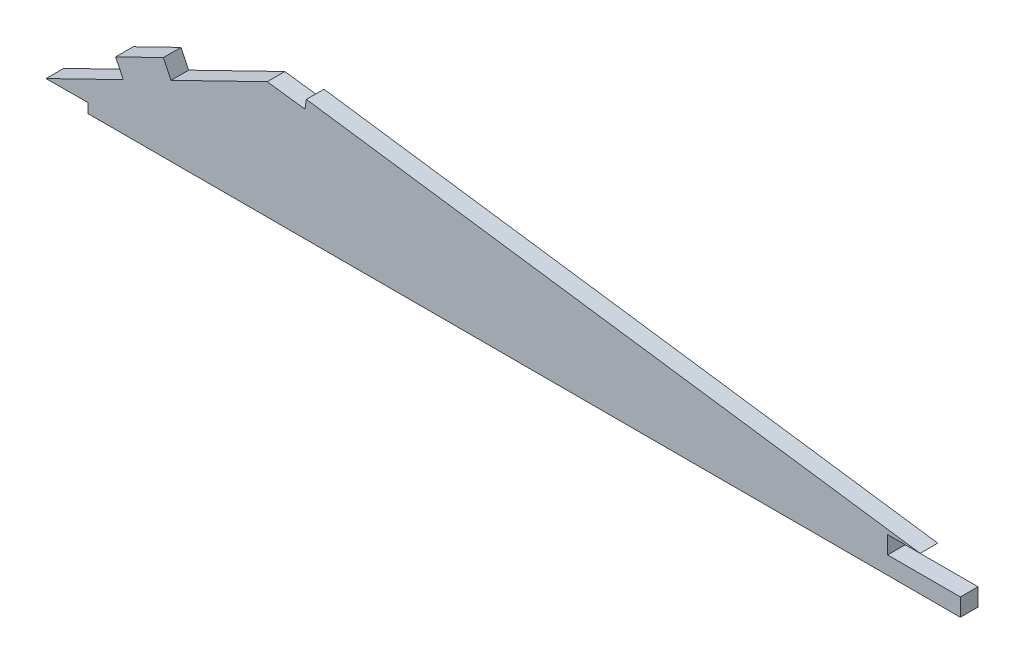
ISO-10303-21;
HEADER;
FILE_DESCRIPTION(('STEP AP214'),'2;1');
FILE_NAME('part.step','',(''),(''),'','','');
FILE_SCHEMA(('AUTOMOTIVE_DESIGN { 1 0 10303 214 1 1 1 1 }'));
ENDSEC;
DATA;
#1=APPLICATION_CONTEXT('core data for automotive mechanical design processes');
#2=APPLICATION_PROTOCOL_DEFINITION('international standard','automotive_design',2000,#1);
#3=PRODUCT_CONTEXT('',#1,'mechanical');
#4=PRODUCT('Part','Part','',(#3));
#5=PRODUCT_RELATED_PRODUCT_CATEGORY('part','',(#4));
#6=PRODUCT_DEFINITION_FORMATION('','',#4);
#7=PRODUCT_DEFINITION_CONTEXT('part definition',#1,'design');
#8=PRODUCT_DEFINITION('design','',#6,#7);
#9=PRODUCT_DEFINITION_SHAPE('','',#8);
#10=(LENGTH_UNIT() NAMED_UNIT(*) SI_UNIT(.MILLI.,.METRE.));
#11=(NAMED_UNIT(*) PLANE_ANGLE_UNIT() SI_UNIT($,.RADIAN.));
#12=(NAMED_UNIT(*) SI_UNIT($,.STERADIAN.) SOLID_ANGLE_UNIT());
#13=UNCERTAINTY_MEASURE_WITH_UNIT(LENGTH_MEASURE(1.E-05),#10,'distance_accuracy_value','');
#14=(GEOMETRIC_REPRESENTATION_CONTEXT(3) GLOBAL_UNCERTAINTY_ASSIGNED_CONTEXT((#13)) GLOBAL_UNIT_ASSIGNED_CONTEXT((#10,
#11,#12)) REPRESENTATION_CONTEXT('',''));
#15=CARTESIAN_POINT('',(0.,0.,0.));
#16=DIRECTION('',(0.,0.,1.));
#17=DIRECTION('',(1.,0.,0.));
#18=AXIS2_PLACEMENT_3D('',#15,#16,#17);
#19=CARTESIAN_POINT('',(15.844545114635,14.6199005087343,2.));
#20=DIRECTION('',(-0.898794046299282,-0.438371146788841,0.));
#21=DIRECTION('',(0.438371146788841,-0.898794046299282,0.));
#22=AXIS2_PLACEMENT_3D('',#19,#20,#21);
#23=PLANE('',#22);
#24=DIRECTION('',(-0.438371146788841,0.898794046299282,0.));
#25=VECTOR('',#24,1.);
#26=CARTESIAN_POINT('',(15.844545114635,14.6199005087343,0.));
#27=LINE('',#26,#25);
#28=CARTESIAN_POINT('',(16.721287408213,12.8223124161351,0.));
#29=VERTEX_POINT('',#28);
#30=CARTESIAN_POINT('',(15.844545114635,14.6199005087343,0.));
#31=VERTEX_POINT('',#30);
#32=EDGE_CURVE('E182',#29,#31,#27,.T.);
#33=ORIENTED_EDGE('',*,*,#32,.T.);
#34=DIRECTION('',(0.,0.,-1.));
#35=VECTOR('',#34,1.);
#36=CARTESIAN_POINT('',(15.844545114635,14.6199005087343,2.));
#37=LINE('',#36,#35);
#38=CARTESIAN_POINT('',(15.844545114635,14.6199005087343,2.));
#39=VERTEX_POINT('',#38);
#40=EDGE_CURVE('E11',#39,#31,#37,.T.);
#41=ORIENTED_EDGE('',*,*,#40,.F.);
#42=DIRECTION('',(-0.438371146788841,0.898794046299282,0.));
#43=VECTOR('',#42,1.);
#44=CARTESIAN_POINT('',(15.844545114635,14.6199005087343,2.));
#45=LINE('',#44,#43);
#46=CARTESIAN_POINT('',(16.721287408213,12.8223124161351,2.));
#47=VERTEX_POINT('',#46);
#48=EDGE_CURVE('E225',#47,#39,#45,.T.);
#49=ORIENTED_EDGE('',*,*,#48,.F.);
#50=DIRECTION('',(0.,0.,-1.));
#51=VECTOR('',#50,1.);
#52=CARTESIAN_POINT('',(16.721287408213,12.8223124161351,2.));
#53=LINE('',#52,#51);
#54=EDGE_CURVE('E178',#47,#29,#53,.T.);
#55=ORIENTED_EDGE('',*,*,#54,.T.);
#56=EDGE_LOOP('',(#33,#41,#49,#55));
#57=FACE_BOUND('',#56,.T.);
#58=ADVANCED_FACE('F39',(#57),#23,.F.);
#59=CARTESIAN_POINT('',(10.4258955683068,11.9770485389714,2.));
#60=DIRECTION('',(0.438371146789212,-0.898794046299101,0.));
#61=DIRECTION('',(0.898794046299101,0.438371146789212,0.));
#62=AXIS2_PLACEMENT_3D('',#59,#60,#61);
#63=PLANE('',#62);
#64=DIRECTION('',(-0.898794046299101,-0.438371146789212,0.));
#65=VECTOR('',#64,1.);
#66=CARTESIAN_POINT('',(10.4258955683068,11.9770485389714,0.));
#67=LINE('',#66,#65);
#68=CARTESIAN_POINT('',(10.4258955683068,11.9770485389714,0.));
#69=VERTEX_POINT('',#68);
#70=EDGE_CURVE('E186',#31,#69,#67,.T.);
#71=ORIENTED_EDGE('',*,*,#70,.T.);
#72=DIRECTION('',(0.,0.,-1.));
#73=VECTOR('',#72,1.);
#74=CARTESIAN_POINT('',(10.4258955683068,11.9770485389714,2.));
#75=LINE('',#74,#73);
#76=CARTESIAN_POINT('',(10.4258955683068,11.9770485389714,2.));
#77=VERTEX_POINT('',#76);
#78=EDGE_CURVE('E48',#77,#69,#75,.T.);
#79=ORIENTED_EDGE('',*,*,#78,.F.);
#80=DIRECTION('',(-0.898794046299101,-0.438371146789212,0.));
#81=VECTOR('',#80,1.);
#82=CARTESIAN_POINT('',(10.4258955683068,11.9770485389714,2.));
#83=LINE('',#82,#81);
#84=EDGE_CURVE('E120',#39,#77,#83,.T.);
#85=ORIENTED_EDGE('',*,*,#84,.F.);
#86=ORIENTED_EDGE('',*,*,#40,.T.);
#87=EDGE_LOOP('',(#71,#79,#85,#86));
#88=FACE_BOUND('',#87,.T.);
#89=ADVANCED_FACE('F340',(#88),#63,.F.);
#90=CARTESIAN_POINT('',(11.3026378618857,10.1794604463754,2.));
#91=DIRECTION('',(0.898794046298798,0.438371146789834,0.));
#92=DIRECTION('',(-0.438371146789834,0.898794046298798,0.));
#93=AXIS2_PLACEMENT_3D('',#90,#91,#92);
#94=PLANE('',#93);
#95=DIRECTION('',(0.438371146789834,-0.898794046298798,0.));
#96=VECTOR('',#95,1.);
#97=CARTESIAN_POINT('',(11.3026378618857,10.1794604463754,0.));
#98=LINE('',#97,#96);
#99=CARTESIAN_POINT('',(11.3026378618857,10.1794604463754,0.));
#100=VERTEX_POINT('',#99);
#101=EDGE_CURVE('E189',#69,#100,#98,.T.);
#102=ORIENTED_EDGE('',*,*,#101,.T.);
#103=DIRECTION('',(0.,0.,-1.));
#104=VECTOR('',#103,1.);
#105=CARTESIAN_POINT('',(11.3026378618857,10.1794604463754,2.));
#106=LINE('',#105,#104);
#107=CARTESIAN_POINT('',(11.3026378618857,10.1794604463754,2.));
#108=VERTEX_POINT('',#107);
#109=EDGE_CURVE('E264',#108,#100,#106,.T.);
#110=ORIENTED_EDGE('',*,*,#109,.F.);
#111=DIRECTION('',(0.438371146789834,-0.898794046298798,0.));
#112=VECTOR('',#111,1.);
#113=CARTESIAN_POINT('',(11.3026378618857,10.1794604463754,2.));
#114=LINE('',#113,#112);
#115=EDGE_CURVE('E274',#77,#108,#114,.T.);
#116=ORIENTED_EDGE('',*,*,#115,.F.);
#117=ORIENTED_EDGE('',*,*,#78,.T.);
#118=EDGE_LOOP('',(#102,#110,#116,#117));
#119=FACE_BOUND('',#118,.T.);
#120=ADVANCED_FACE('F272',(#119),#94,.F.);
#121=CARTESIAN_POINT('',(2.52896989953078,5.90025665987847,2.));
#122=DIRECTION('',(0.438371146789097,-0.898794046299158,0.));
#123=DIRECTION('',(0.898794046299158,0.438371146789097,0.));
#124=AXIS2_PLACEMENT_3D('',#121,#122,#123);
#125=PLANE('',#124);
#126=DIRECTION('',(-0.898794046299158,-0.438371146789097,0.));
#127=VECTOR('',#126,1.);
#128=CARTESIAN_POINT('',(2.52896989953078,5.90025665987847,0.));
#129=LINE('',#128,#127);
#130=CARTESIAN_POINT('',(2.52896989953078,5.90025665987847,0.));
#131=VERTEX_POINT('',#130);
#132=EDGE_CURVE('E192',#100,#131,#129,.T.);
#133=ORIENTED_EDGE('',*,*,#132,.T.);
#134=DIRECTION('',(0.,0.,-1.));
#135=VECTOR('',#134,1.);
#136=CARTESIAN_POINT('',(2.52896989953078,5.90025665987847,2.));
#137=LINE('',#136,#135);
#138=CARTESIAN_POINT('',(2.52896989953078,5.90025665987847,2.));
#139=VERTEX_POINT('',#138);
#140=EDGE_CURVE('E260',#139,#131,#137,.T.);
#141=ORIENTED_EDGE('',*,*,#140,.F.);
#142=DIRECTION('',(-0.898794046299158,-0.438371146789097,0.));
#143=VECTOR('',#142,1.);
#144=CARTESIAN_POINT('',(2.52896989953078,5.90025665987847,2.));
#145=LINE('',#144,#143);
#146=EDGE_CURVE('E293',#108,#139,#145,.T.);
#147=ORIENTED_EDGE('',*,*,#146,.F.);
#148=ORIENTED_EDGE('',*,*,#109,.T.);
#149=EDGE_LOOP('',(#133,#141,#147,#148));
#150=FACE_BOUND('',#149,.T.);
#151=ADVANCED_FACE('F283',(#150),#125,.F.);
#152=CARTESIAN_POINT('',(7.31043569777975,5.91881293104703,2.));
#153=DIRECTION('',(-0.00388084579359874,0.999992469489609,0.));
#154=DIRECTION('',(-0.999992469489609,-0.00388084579359874,0.));
#155=AXIS2_PLACEMENT_3D('',#152,#153,#154);
#156=PLANE('',#155);
#157=DIRECTION('',(0.999992469489609,0.00388084579359873,0.));
#158=VECTOR('',#157,1.);
#159=CARTESIAN_POINT('',(7.31043569777975,5.91881293104703,0.));
#160=LINE('',#159,#158);
#161=CARTESIAN_POINT('',(7.31043569777975,5.91881293104703,0.));
#162=VERTEX_POINT('',#161);
#163=EDGE_CURVE('E195',#131,#162,#160,.T.);
#164=ORIENTED_EDGE('',*,*,#163,.T.);
#165=DIRECTION('',(0.,0.,-1.));
#166=VECTOR('',#165,1.);
#167=CARTESIAN_POINT('',(7.31043569777975,5.91881293104703,2.));
#168=LINE('',#167,#166);
#169=CARTESIAN_POINT('',(7.31043569777975,5.91881293104703,2.));
#170=VERTEX_POINT('',#169);
#171=EDGE_CURVE('E256',#170,#162,#168,.T.);
#172=ORIENTED_EDGE('',*,*,#171,.F.);
#173=DIRECTION('',(0.999992469489609,0.00388084579359873,0.));
#174=VECTOR('',#173,1.);
#175=CARTESIAN_POINT('',(7.31043569777975,5.91881293104703,2.));
#176=LINE('',#175,#174);
#177=EDGE_CURVE('E289',#139,#170,#176,.T.);
#178=ORIENTED_EDGE('',*,*,#177,.F.);
#179=ORIENTED_EDGE('',*,*,#140,.T.);
#180=EDGE_LOOP('',(#164,#172,#178,#179));
#181=FACE_BOUND('',#180,.T.);
#182=ADVANCED_FACE('F287',(#181),#156,.F.);
#183=CARTESIAN_POINT('',(7.3146393222456,4.83564883822297,2.));
#184=DIRECTION('',(0.99999246948962,0.00388084579082327,0.));
#185=DIRECTION('',(-0.00388084579082327,0.99999246948962,0.));
#186=AXIS2_PLACEMENT_3D('',#183,#184,#185);
#187=PLANE('',#186);
#188=DIRECTION('',(0.00388084579082327,-0.99999246948962,0.));
#189=VECTOR('',#188,1.);
#190=CARTESIAN_POINT('',(7.3146393222456,4.83564883822297,0.));
#191=LINE('',#190,#189);
#192=CARTESIAN_POINT('',(7.3146393222456,4.83564883822297,0.));
#193=VERTEX_POINT('',#192);
#194=EDGE_CURVE('E198',#162,#193,#191,.T.);
#195=ORIENTED_EDGE('',*,*,#194,.T.);
#196=DIRECTION('',(0.,0.,-1.));
#197=VECTOR('',#196,1.);
#198=CARTESIAN_POINT('',(7.3146393222456,4.83564883822297,2.));
#199=LINE('',#198,#197);
#200=CARTESIAN_POINT('',(7.3146393222456,4.83564883822297,2.));
#201=VERTEX_POINT('',#200);
#202=EDGE_CURVE('E252',#201,#193,#199,.T.);
#203=ORIENTED_EDGE('',*,*,#202,.F.);
#204=DIRECTION('',(0.00388084579082327,-0.99999246948962,0.));
#205=VECTOR('',#204,1.);
#206=CARTESIAN_POINT('',(7.3146393222456,4.83564883822297,2.));
#207=LINE('',#206,#205);
#208=EDGE_CURVE('E292',#170,#201,#207,.T.);
#209=ORIENTED_EDGE('',*,*,#208,.F.);
#210=ORIENTED_EDGE('',*,*,#171,.T.);
#211=EDGE_LOOP('',(#195,#203,#209,#210));
#212=FACE_BOUND('',#211,.T.);
#213=ADVANCED_FACE('F353',(#212),#187,.F.);
#214=CARTESIAN_POINT('',(7.3146393222456,4.83564883822297,2.));
#215=DIRECTION('',(0.,1.,0.));
#216=DIRECTION('',(0.,0.,1.));
#217=AXIS2_PLACEMENT_3D('',#214,#215,#216);
#218=PLANE('',#217);
#219=DIRECTION('',(1.,0.,0.));
#220=VECTOR('',#219,1.);
#221=CARTESIAN_POINT('',(7.3146393222456,4.83564883822297,0.));
#222=LINE('',#221,#220);
#223=CARTESIAN_POINT('',(106.29161027576,4.83564883822297,0.));
#224=VERTEX_POINT('',#223);
#225=EDGE_CURVE('E201',#193,#224,#222,.T.);
#226=ORIENTED_EDGE('',*,*,#225,.T.);
#227=DIRECTION('',(0.,0.,-1.));
#228=VECTOR('',#227,1.);
#229=CARTESIAN_POINT('',(106.29161027576,4.83564883822297,2.));
#230=LINE('',#229,#228);
#231=CARTESIAN_POINT('',(106.29161027576,4.83564883822297,2.));
#232=VERTEX_POINT('',#231);
#233=EDGE_CURVE('E248',#232,#224,#230,.T.);
#234=ORIENTED_EDGE('',*,*,#233,.F.);
#235=DIRECTION('',(1.,0.,0.));
#236=VECTOR('',#235,1.);
#237=CARTESIAN_POINT('',(7.3146393222456,4.83564883822297,2.));
#238=LINE('',#237,#236);
#239=EDGE_CURVE('E297',#201,#232,#238,.T.);
#240=ORIENTED_EDGE('',*,*,#239,.F.);
#241=ORIENTED_EDGE('',*,*,#202,.T.);
#242=EDGE_LOOP('',(#226,#234,#240,#241));
#243=FACE_BOUND('',#242,.T.);
#244=ADVANCED_FACE('F356',(#243),#218,.F.);
#245=CARTESIAN_POINT('',(106.29161027576,4.83564883822297,2.));
#246=DIRECTION('',(-1.,0.,0.));
#247=DIRECTION('',(0.,0.,1.));
#248=AXIS2_PLACEMENT_3D('',#245,#246,#247);
#249=PLANE('',#248);
#250=DIRECTION('',(0.,1.,0.));
#251=VECTOR('',#250,1.);
#252=CARTESIAN_POINT('',(106.29161027576,4.83564883822297,0.));
#253=LINE('',#252,#251);
#254=CARTESIAN_POINT('',(106.29161027576,6.83564883822388,0.));
#255=VERTEX_POINT('',#254);
#256=EDGE_CURVE('E204',#224,#255,#253,.T.);
#257=ORIENTED_EDGE('',*,*,#256,.T.);
#258=DIRECTION('',(0.,0.,-1.));
#259=VECTOR('',#258,1.);
#260=CARTESIAN_POINT('',(106.29161027576,6.83564883822388,2.));
#261=LINE('',#260,#259);
#262=CARTESIAN_POINT('',(106.29161027576,6.83564883822388,2.));
#263=VERTEX_POINT('',#262);
#264=EDGE_CURVE('E244',#263,#255,#261,.T.);
#265=ORIENTED_EDGE('',*,*,#264,.F.);
#266=DIRECTION('',(0.,1.,0.));
#267=VECTOR('',#266,1.);
#268=CARTESIAN_POINT('',(106.29161027576,4.83564883822297,2.));
#269=LINE('',#268,#267);
#270=EDGE_CURVE('E304',#232,#263,#269,.T.);
#271=ORIENTED_EDGE('',*,*,#270,.F.);
#272=ORIENTED_EDGE('',*,*,#233,.T.);
#273=EDGE_LOOP('',(#257,#265,#271,#272));
#274=FACE_BOUND('',#273,.T.);
#275=ADVANCED_FACE('F360',(#274),#249,.F.);
#276=CARTESIAN_POINT('',(98.0354338797793,6.83564883822342,2.));
#277=DIRECTION('',(0.,-1.,0.));
#278=DIRECTION('',(1.,0.,0.));
#279=AXIS2_PLACEMENT_3D('',#276,#277,#278);
#280=PLANE('',#279);
#281=DIRECTION('',(-1.,0.,0.));
#282=VECTOR('',#281,1.);
#283=CARTESIAN_POINT('',(98.0354338797793,6.83564883822342,0.));
#284=LINE('',#283,#282);
#285=CARTESIAN_POINT('',(98.0354338797793,6.83564883822342,0.));
#286=VERTEX_POINT('',#285);
#287=EDGE_CURVE('E207',#255,#286,#284,.T.);
#288=ORIENTED_EDGE('',*,*,#287,.T.);
#289=DIRECTION('',(0.,0.,-1.));
#290=VECTOR('',#289,1.);
#291=CARTESIAN_POINT('',(98.0354338797793,6.83564883822342,2.));
#292=LINE('',#291,#290);
#293=CARTESIAN_POINT('',(98.0354338797793,6.83564883822342,2.));
#294=VERTEX_POINT('',#293);
#295=EDGE_CURVE('E240',#294,#286,#292,.T.);
#296=ORIENTED_EDGE('',*,*,#295,.F.);
#297=DIRECTION('',(-1.,0.,0.));
#298=VECTOR('',#297,1.);
#299=CARTESIAN_POINT('',(98.0354338797793,6.83564883822342,2.));
#300=LINE('',#299,#298);
#301=EDGE_CURVE('E307',#263,#294,#300,.T.);
#302=ORIENTED_EDGE('',*,*,#301,.F.);
#303=ORIENTED_EDGE('',*,*,#264,.T.);
#304=EDGE_LOOP('',(#288,#296,#302,#303));
#305=FACE_BOUND('',#304,.T.);
#306=ADVANCED_FACE('F364',(#305),#280,.F.);
#307=CARTESIAN_POINT('',(98.0354338797793,6.83564883822342,2.));
#308=DIRECTION('',(-1.,-4.57966997657773E-13,0.));
#309=DIRECTION('',(4.57966997657773E-13,-1.,0.));
#310=AXIS2_PLACEMENT_3D('',#307,#308,#309);
#311=PLANE('',#310);
#312=DIRECTION('',(-4.57966997657773E-13,1.,0.));
#313=VECTOR('',#312,1.);
#314=CARTESIAN_POINT('',(98.0354338797793,6.83564883822342,0.));
#315=LINE('',#314,#313);
#316=CARTESIAN_POINT('',(98.0354338797784,8.83564883822388,0.));
#317=VERTEX_POINT('',#316);
#318=EDGE_CURVE('E210',#286,#317,#315,.T.);
#319=ORIENTED_EDGE('',*,*,#318,.T.);
#320=DIRECTION('',(0.,0.,-1.));
#321=VECTOR('',#320,1.);
#322=CARTESIAN_POINT('',(98.0354338797784,8.83564883822388,2.));
#323=LINE('',#322,#321);
#324=CARTESIAN_POINT('',(98.0354338797784,8.83564883822388,2.));
#325=VERTEX_POINT('',#324);
#326=EDGE_CURVE('E236',#325,#317,#323,.T.);
#327=ORIENTED_EDGE('',*,*,#326,.F.);
#328=DIRECTION('',(-4.57966997657773E-13,1.,0.));
#329=VECTOR('',#328,1.);
#330=CARTESIAN_POINT('',(98.0354338797793,6.83564883822342,2.));
#331=LINE('',#330,#329);
#332=EDGE_CURVE('E310',#294,#325,#331,.T.);
#333=ORIENTED_EDGE('',*,*,#332,.F.);
#334=ORIENTED_EDGE('',*,*,#295,.T.);
#335=EDGE_LOOP('',(#319,#327,#333,#334));
#336=FACE_BOUND('',#335,.T.);
#337=ADVANCED_FACE('F368',(#336),#311,.F.);
#338=CARTESIAN_POINT('',(98.0354338797784,8.83564883822388,2.));
#339=DIRECTION('',(-2.46511092201905E-13,1.,0.));
#340=DIRECTION('',(-1.,-2.46511092201905E-13,0.));
#341=AXIS2_PLACEMENT_3D('',#338,#339,#340);
#342=PLANE('',#341);
#343=DIRECTION('',(1.,2.46511092201905E-13,0.));
#344=VECTOR('',#343,1.);
#345=CARTESIAN_POINT('',(98.0354338797784,8.83564883822388,0.));
#346=LINE('',#345,#344);
#347=CARTESIAN_POINT('',(101.722874851673,8.83564883822478,0.));
#348=VERTEX_POINT('',#347);
#349=EDGE_CURVE('E213',#317,#348,#346,.T.);
#350=ORIENTED_EDGE('',*,*,#349,.T.);
#351=DIRECTION('',(0.,0.,-1.));
#352=VECTOR('',#351,1.);
#353=CARTESIAN_POINT('',(101.722874851673,8.83564883822478,2.));
#354=LINE('',#353,#352);
#355=CARTESIAN_POINT('',(101.722874851673,8.83564883822478,2.));
#356=VERTEX_POINT('',#355);
#357=EDGE_CURVE('E232',#356,#348,#354,.T.);
#358=ORIENTED_EDGE('',*,*,#357,.F.);
#359=DIRECTION('',(1.,2.46511092201905E-13,0.));
#360=VECTOR('',#359,1.);
#361=CARTESIAN_POINT('',(98.0354338797784,8.83564883822388,2.));
#362=LINE('',#361,#360);
#363=EDGE_CURVE('E313',#325,#356,#362,.T.);
#364=ORIENTED_EDGE('',*,*,#363,.F.);
#365=ORIENTED_EDGE('',*,*,#326,.T.);
#366=EDGE_LOOP('',(#350,#358,#364,#365));
#367=FACE_BOUND('',#366,.T.);
#368=ADVANCED_FACE('F321',(#367),#342,.F.);
#369=CARTESIAN_POINT('',(32.0713085036737,18.6245381111018,2.));
#370=DIRECTION('',(-0.139173100960067,-0.99026806874157,0.));
#371=DIRECTION('',(0.99026806874157,-0.139173100960067,0.));
#372=AXIS2_PLACEMENT_3D('',#369,#370,#371);
#373=PLANE('',#372);
#374=DIRECTION('',(-0.99026806874157,0.139173100960067,0.));
#375=VECTOR('',#374,1.);
#376=CARTESIAN_POINT('',(32.0713085036737,18.6245381111018,0.));
#377=LINE('',#376,#375);
#378=CARTESIAN_POINT('',(32.0713085036737,18.6245381111018,0.));
#379=VERTEX_POINT('',#378);
#380=EDGE_CURVE('E216',#348,#379,#377,.T.);
#381=ORIENTED_EDGE('',*,*,#380,.T.);
#382=DIRECTION('',(0.,0.,-1.));
#383=VECTOR('',#382,1.);
#384=CARTESIAN_POINT('',(32.0713085036737,18.6245381111018,2.));
#385=LINE('',#384,#383);
#386=CARTESIAN_POINT('',(32.0713085036737,18.6245381111018,2.));
#387=VERTEX_POINT('',#386);
#388=EDGE_CURVE('E171',#387,#379,#385,.T.);
#389=ORIENTED_EDGE('',*,*,#388,.F.);
#390=DIRECTION('',(-0.99026806874157,0.139173100960067,0.));
#391=VECTOR('',#390,1.);
#392=CARTESIAN_POINT('',(32.0713085036737,18.6245381111018,2.));
#393=LINE('',#392,#391);
#394=EDGE_CURVE('E160',#356,#387,#393,.T.);
#395=ORIENTED_EDGE('',*,*,#394,.F.);
#396=ORIENTED_EDGE('',*,*,#357,.T.);
#397=EDGE_LOOP('',(#381,#389,#395,#396));
#398=FACE_BOUND('',#397,.T.);
#399=ADVANCED_FACE('F325',(#398),#373,.F.);
#400=CARTESIAN_POINT('',(31.9230984508827,17.5868458536476,2.));
#401=DIRECTION('',(0.989953726819002,-0.141391720964029,0.));
#402=DIRECTION('',(0.141391720964029,0.989953726819002,0.));
#403=AXIS2_PLACEMENT_3D('',#400,#401,#402);
#404=PLANE('',#403);
#405=DIRECTION('',(-0.141391720964029,-0.989953726819001,0.));
#406=VECTOR('',#405,1.);
#407=CARTESIAN_POINT('',(31.9230984508827,17.5868458536476,0.));
#408=LINE('',#407,#406);
#409=CARTESIAN_POINT('',(31.9230984508827,17.5868458536476,0.));
#410=VERTEX_POINT('',#409);
#411=EDGE_CURVE('E169',#379,#410,#408,.T.);
#412=ORIENTED_EDGE('',*,*,#411,.T.);
#413=DIRECTION('',(0.,0.,-1.));
#414=VECTOR('',#413,1.);
#415=CARTESIAN_POINT('',(31.9230984508827,17.5868458536476,2.));
#416=LINE('',#415,#414);
#417=CARTESIAN_POINT('',(31.9230984508827,17.5868458536476,2.));
#418=VERTEX_POINT('',#417);
#419=EDGE_CURVE('E166',#418,#410,#416,.T.);
#420=ORIENTED_EDGE('',*,*,#419,.F.);
#421=DIRECTION('',(-0.141391720964029,-0.989953726819001,0.));
#422=VECTOR('',#421,1.);
#423=CARTESIAN_POINT('',(31.9230984508827,17.5868458536476,2.));
#424=LINE('',#423,#422);
#425=EDGE_CURVE('E154',#387,#418,#424,.T.);
#426=ORIENTED_EDGE('',*,*,#425,.F.);
#427=ORIENTED_EDGE('',*,*,#388,.T.);
#428=EDGE_LOOP('',(#412,#420,#426,#427));
#429=FACE_BOUND('',#428,.T.);
#430=ADVANCED_FACE('F167',(#429),#404,.F.);
#431=CARTESIAN_POINT('',(27.6288728275127,18.1422972876932,2.));
#432=DIRECTION('',(-0.128279776915875,-0.991738019254286,0.));
#433=DIRECTION('',(0.991738019254286,-0.128279776915875,0.));
#434=AXIS2_PLACEMENT_3D('',#431,#432,#433);
#435=PLANE('',#434);
#436=DIRECTION('',(-0.991738019254285,0.128279776915875,0.));
#437=VECTOR('',#436,1.);
#438=CARTESIAN_POINT('',(27.6288728275127,18.1422972876932,0.));
#439=LINE('',#438,#437);
#440=CARTESIAN_POINT('',(27.6288728275127,18.1422972876932,0.));
#441=VERTEX_POINT('',#440);
#442=EDGE_CURVE('E106',#410,#441,#439,.T.);
#443=ORIENTED_EDGE('',*,*,#442,.T.);
#444=DIRECTION('',(0.,0.,-1.));
#445=VECTOR('',#444,1.);
#446=CARTESIAN_POINT('',(27.6288728275127,18.1422972876932,2.));
#447=LINE('',#446,#445);
#448=CARTESIAN_POINT('',(27.6288728275127,18.1422972876932,2.));
#449=VERTEX_POINT('',#448);
#450=EDGE_CURVE('E172',#449,#441,#447,.T.);
#451=ORIENTED_EDGE('',*,*,#450,.F.);
#452=DIRECTION('',(-0.991738019254285,0.128279776915875,0.));
#453=VECTOR('',#452,1.);
#454=CARTESIAN_POINT('',(27.6288728275127,18.1422972876932,2.));
#455=LINE('',#454,#453);
#456=EDGE_CURVE('E158',#418,#449,#455,.T.);
#457=ORIENTED_EDGE('',*,*,#456,.F.);
#458=ORIENTED_EDGE('',*,*,#419,.T.);
#459=EDGE_LOOP('',(#443,#451,#457,#458));
#460=FACE_BOUND('',#459,.T.);
#461=ADVANCED_FACE('F174',(#460),#435,.F.);
#462=CARTESIAN_POINT('',(16.721287408213,12.8223124161351,2.));
#463=DIRECTION('',(0.438371146789062,-0.898794046299175,0.));
#464=DIRECTION('',(0.898794046299175,0.438371146789062,0.));
#465=AXIS2_PLACEMENT_3D('',#462,#463,#464);
#466=PLANE('',#465);
#467=DIRECTION('',(-0.898794046299175,-0.438371146789062,0.));
#468=VECTOR('',#467,1.);
#469=CARTESIAN_POINT('',(16.721287408213,12.8223124161351,0.));
#470=LINE('',#469,#468);
#471=EDGE_CURVE('E112',#441,#29,#470,.T.);
#472=ORIENTED_EDGE('',*,*,#471,.T.);
#473=ORIENTED_EDGE('',*,*,#54,.F.);
#474=DIRECTION('',(-0.898794046299175,-0.438371146789062,0.));
#475=VECTOR('',#474,1.);
#476=CARTESIAN_POINT('',(16.721287408213,12.8223124161351,2.));
#477=LINE('',#476,#475);
#478=EDGE_CURVE('E56',#449,#47,#477,.T.);
#479=ORIENTED_EDGE('',*,*,#478,.F.);
#480=ORIENTED_EDGE('',*,*,#450,.T.);
#481=EDGE_LOOP('',(#472,#473,#479,#480));
#482=FACE_BOUND('',#481,.T.);
#483=ADVANCED_FACE('F329',(#482),#466,.F.);
#484=CARTESIAN_POINT('',(0.,0.,2.));
#485=DIRECTION('',(0.,0.,1.));
#486=DIRECTION('',(1.,0.,0.));
#487=AXIS2_PLACEMENT_3D('',#484,#485,#486);
#488=PLANE('',#487);
#489=ORIENTED_EDGE('',*,*,#48,.T.);
#490=ORIENTED_EDGE('',*,*,#84,.T.);
#491=ORIENTED_EDGE('',*,*,#115,.T.);
#492=ORIENTED_EDGE('',*,*,#146,.T.);
#493=ORIENTED_EDGE('',*,*,#177,.T.);
#494=ORIENTED_EDGE('',*,*,#208,.T.);
#495=ORIENTED_EDGE('',*,*,#239,.T.);
#496=ORIENTED_EDGE('',*,*,#270,.T.);
#497=ORIENTED_EDGE('',*,*,#301,.T.);
#498=ORIENTED_EDGE('',*,*,#332,.T.);
#499=ORIENTED_EDGE('',*,*,#363,.T.);
#500=ORIENTED_EDGE('',*,*,#394,.T.);
#501=ORIENTED_EDGE('',*,*,#425,.T.);
#502=ORIENTED_EDGE('',*,*,#456,.T.);
#503=ORIENTED_EDGE('',*,*,#478,.T.);
#504=EDGE_LOOP('',(#489,#490,#491,#492,#493,#494,#495,#496,#497,#498,#499,#500,#501,#502,#503));
#505=FACE_BOUND('',#504,.T.);
#506=ADVANCED_FACE('F156',(#505),#488,.T.);
#507=CARTESIAN_POINT('',(0.,0.,0.));
#508=DIRECTION('',(0.,0.,1.));
#509=DIRECTION('',(1.,0.,0.));
#510=AXIS2_PLACEMENT_3D('',#507,#508,#509);
#511=PLANE('',#510);
#512=ORIENTED_EDGE('',*,*,#32,.F.);
#513=ORIENTED_EDGE('',*,*,#471,.F.);
#514=ORIENTED_EDGE('',*,*,#442,.F.);
#515=ORIENTED_EDGE('',*,*,#411,.F.);
#516=ORIENTED_EDGE('',*,*,#380,.F.);
#517=ORIENTED_EDGE('',*,*,#349,.F.);
#518=ORIENTED_EDGE('',*,*,#318,.F.);
#519=ORIENTED_EDGE('',*,*,#287,.F.);
#520=ORIENTED_EDGE('',*,*,#256,.F.);
#521=ORIENTED_EDGE('',*,*,#225,.F.);
#522=ORIENTED_EDGE('',*,*,#194,.F.);
#523=ORIENTED_EDGE('',*,*,#163,.F.);
#524=ORIENTED_EDGE('',*,*,#132,.F.);
#525=ORIENTED_EDGE('',*,*,#101,.F.);
#526=ORIENTED_EDGE('',*,*,#70,.F.);
#527=EDGE_LOOP('',(#512,#513,#514,#515,#516,#517,#518,#519,#520,#521,#522,#523,#524,#525,#526));
#528=FACE_BOUND('',#527,.T.);
#529=ADVANCED_FACE('F278',(#528),#511,.F.);
#530=CLOSED_SHELL('',(#58,#89,#120,#151,#182,#213,#244,#275,#306,#337,#368,#399,#430,#461,#483,
#506,#529));
#531=MANIFOLD_SOLID_BREP('B2',#530);
#532=ADVANCED_BREP_SHAPE_REPRESENTATION('',(#18,#531),#14);
#533=SHAPE_DEFINITION_REPRESENTATION(#9,#532);
ENDSEC;
END-ISO-10303-21;
